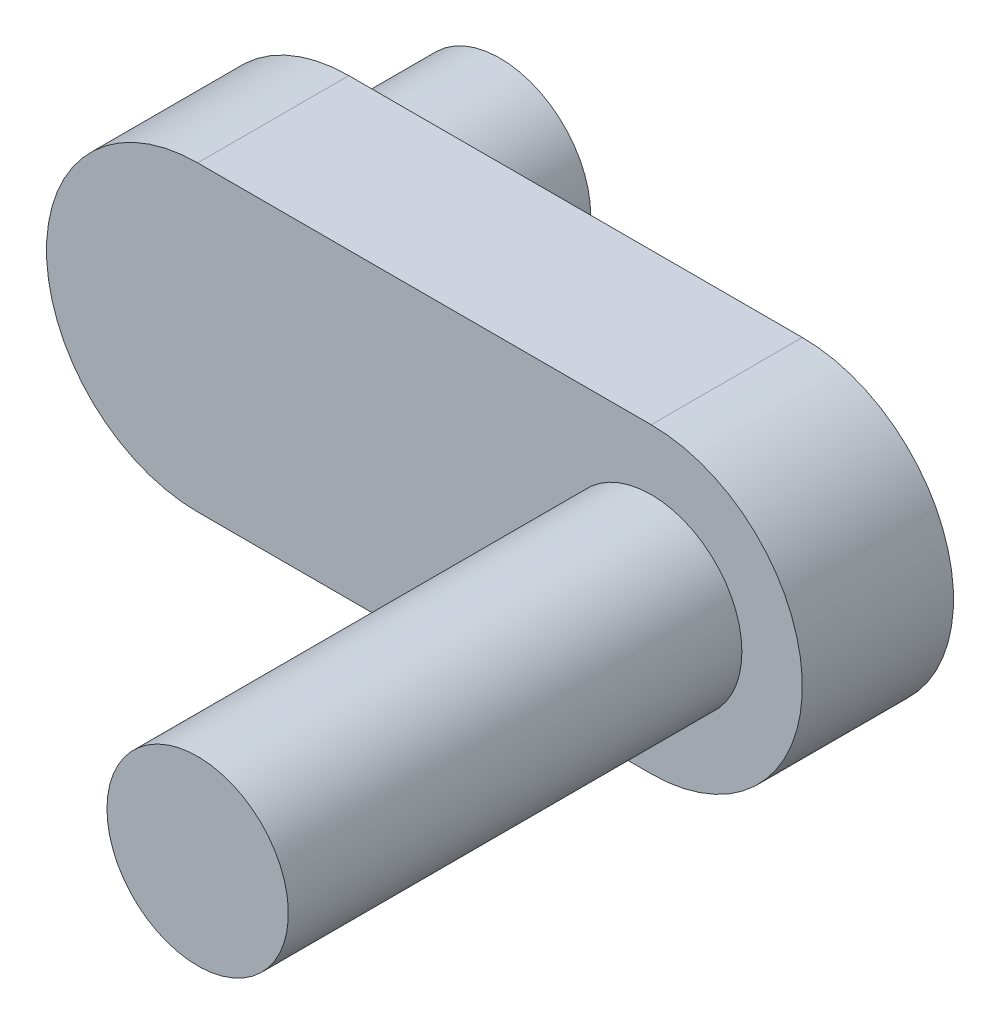
ISO-10303-21;
HEADER;
FILE_DESCRIPTION(('STEP AP214'),'2;1');
FILE_NAME('part.step','',(''),(''),'','','');
FILE_SCHEMA(('AUTOMOTIVE_DESIGN { 1 0 10303 214 1 1 1 1 }'));
ENDSEC;
DATA;
#1=APPLICATION_CONTEXT('core data for automotive mechanical design processes');
#2=APPLICATION_PROTOCOL_DEFINITION('international standard','automotive_design',2000,#1);
#3=PRODUCT_CONTEXT('',#1,'mechanical');
#4=PRODUCT('Part','Part','',(#3));
#5=PRODUCT_RELATED_PRODUCT_CATEGORY('part','',(#4));
#6=PRODUCT_DEFINITION_FORMATION('','',#4);
#7=PRODUCT_DEFINITION_CONTEXT('part definition',#1,'design');
#8=PRODUCT_DEFINITION('design','',#6,#7);
#9=PRODUCT_DEFINITION_SHAPE('','',#8);
#10=(LENGTH_UNIT() NAMED_UNIT(*) SI_UNIT(.MILLI.,.METRE.));
#11=(NAMED_UNIT(*) PLANE_ANGLE_UNIT() SI_UNIT($,.RADIAN.));
#12=(NAMED_UNIT(*) SI_UNIT($,.STERADIAN.) SOLID_ANGLE_UNIT());
#13=UNCERTAINTY_MEASURE_WITH_UNIT(LENGTH_MEASURE(1.E-05),#10,'distance_accuracy_value','');
#14=(GEOMETRIC_REPRESENTATION_CONTEXT(3) GLOBAL_UNCERTAINTY_ASSIGNED_CONTEXT((#13)) GLOBAL_UNIT_ASSIGNED_CONTEXT((#10,
#11,#12)) REPRESENTATION_CONTEXT('',''));
#15=CARTESIAN_POINT('',(0.,0.,0.));
#16=DIRECTION('',(0.,0.,1.));
#17=DIRECTION('',(1.,0.,0.));
#18=AXIS2_PLACEMENT_3D('',#15,#16,#17);
#19=CARTESIAN_POINT('',(7.5,0.,5.));
#20=DIRECTION('',(0.,0.,1.));
#21=DIRECTION('',(1.,0.,0.));
#22=AXIS2_PLACEMENT_3D('',#19,#20,#21);
#23=PLANE('',#22);
#24=CARTESIAN_POINT('',(7.5,0.,5.));
#25=DIRECTION('',(0.,0.,1.));
#26=DIRECTION('',(1.,0.,0.));
#27=AXIS2_PLACEMENT_3D('',#24,#25,#26);
#28=CIRCLE('',#27,5.);
#29=CARTESIAN_POINT('',(7.5,-5.,5.));
#30=VERTEX_POINT('',#29);
#31=CARTESIAN_POINT('',(7.5,5.,5.));
#32=VERTEX_POINT('',#31);
#33=EDGE_CURVE('E86',#30,#32,#28,.T.);
#34=ORIENTED_EDGE('',*,*,#33,.T.);
#35=DIRECTION('',(-1.,0.,0.));
#36=VECTOR('',#35,1.);
#37=CARTESIAN_POINT('',(7.5,5.,5.));
#38=LINE('',#37,#36);
#39=CARTESIAN_POINT('',(-7.5,5.,5.));
#40=VERTEX_POINT('',#39);
#41=EDGE_CURVE('E81',#32,#40,#38,.T.);
#42=ORIENTED_EDGE('',*,*,#41,.T.);
#43=CARTESIAN_POINT('',(-7.5,0.,5.));
#44=DIRECTION('',(0.,0.,1.));
#45=DIRECTION('',(1.,0.,0.));
#46=AXIS2_PLACEMENT_3D('',#43,#44,#45);
#47=CIRCLE('',#46,5.);
#48=CARTESIAN_POINT('',(-7.5,-5.,5.));
#49=VERTEX_POINT('',#48);
#50=EDGE_CURVE('E84',#40,#49,#47,.T.);
#51=ORIENTED_EDGE('',*,*,#50,.T.);
#52=DIRECTION('',(1.,0.,0.));
#53=VECTOR('',#52,1.);
#54=CARTESIAN_POINT('',(7.5,-5.,5.));
#55=LINE('',#54,#53);
#56=EDGE_CURVE('E51',#49,#30,#55,.T.);
#57=ORIENTED_EDGE('',*,*,#56,.T.);
#58=EDGE_LOOP('',(#34,#42,#51,#57));
#59=FACE_BOUND('',#58,.T.);
#60=CARTESIAN_POINT('',(7.5,0.,5.));
#61=DIRECTION('',(0.,0.,1.));
#62=DIRECTION('',(1.,0.,0.));
#63=AXIS2_PLACEMENT_3D('',#60,#61,#62);
#64=CIRCLE('',#63,3.);
#65=CARTESIAN_POINT('',(10.5,0.,5.));
#66=VERTEX_POINT('',#65);
#67=EDGE_CURVE('E101',#66,#66,#64,.T.);
#68=ORIENTED_EDGE('',*,*,#67,.F.);
#69=EDGE_LOOP('',(#68));
#70=FACE_BOUND('',#69,.T.);
#71=ADVANCED_FACE('F34',(#59,#70),#23,.T.);
#72=CARTESIAN_POINT('',(7.5,0.,0.));
#73=DIRECTION('',(0.,0.,1.));
#74=DIRECTION('',(1.,0.,0.));
#75=AXIS2_PLACEMENT_3D('',#72,#73,#74);
#76=PLANE('',#75);
#77=CARTESIAN_POINT('',(7.5,0.,0.));
#78=DIRECTION('',(0.,0.,1.));
#79=DIRECTION('',(1.,0.,0.));
#80=AXIS2_PLACEMENT_3D('',#77,#78,#79);
#81=CIRCLE('',#80,5.);
#82=CARTESIAN_POINT('',(7.5,-5.,0.));
#83=VERTEX_POINT('',#82);
#84=CARTESIAN_POINT('',(7.5,5.,0.));
#85=VERTEX_POINT('',#84);
#86=EDGE_CURVE('E98',#83,#85,#81,.T.);
#87=ORIENTED_EDGE('',*,*,#86,.F.);
#88=DIRECTION('',(1.,0.,0.));
#89=VECTOR('',#88,1.);
#90=CARTESIAN_POINT('',(7.5,-5.,0.));
#91=LINE('',#90,#89);
#92=CARTESIAN_POINT('',(-7.5,-5.,0.));
#93=VERTEX_POINT('',#92);
#94=EDGE_CURVE('E74',#93,#83,#91,.T.);
#95=ORIENTED_EDGE('',*,*,#94,.F.);
#96=CARTESIAN_POINT('',(-7.5,0.,0.));
#97=DIRECTION('',(0.,0.,1.));
#98=DIRECTION('',(1.,0.,0.));
#99=AXIS2_PLACEMENT_3D('',#96,#97,#98);
#100=CIRCLE('',#99,5.);
#101=CARTESIAN_POINT('',(-7.5,5.,0.));
#102=VERTEX_POINT('',#101);
#103=EDGE_CURVE('E68',#102,#93,#100,.T.);
#104=ORIENTED_EDGE('',*,*,#103,.F.);
#105=DIRECTION('',(-1.,0.,0.));
#106=VECTOR('',#105,1.);
#107=CARTESIAN_POINT('',(7.5,5.,0.));
#108=LINE('',#107,#106);
#109=EDGE_CURVE('E90',#85,#102,#108,.T.);
#110=ORIENTED_EDGE('',*,*,#109,.F.);
#111=EDGE_LOOP('',(#87,#95,#104,#110));
#112=FACE_BOUND('',#111,.T.);
#113=CARTESIAN_POINT('',(-7.5,0.,0.));
#114=DIRECTION('',(0.,0.,1.));
#115=DIRECTION('',(1.,0.,0.));
#116=AXIS2_PLACEMENT_3D('',#113,#114,#115);
#117=CIRCLE('',#116,3.);
#118=CARTESIAN_POINT('',(-4.5,0.,0.));
#119=VERTEX_POINT('',#118);
#120=EDGE_CURVE('E115',#119,#119,#117,.T.);
#121=ORIENTED_EDGE('',*,*,#120,.T.);
#122=EDGE_LOOP('',(#121));
#123=FACE_BOUND('',#122,.T.);
#124=ADVANCED_FACE('F109',(#112,#123),#76,.F.);
#125=CARTESIAN_POINT('',(7.5,0.,5.));
#126=DIRECTION('',(0.,0.,-1.));
#127=DIRECTION('',(-1.,0.,0.));
#128=AXIS2_PLACEMENT_3D('',#125,#126,#127);
#129=CYLINDRICAL_SURFACE('',#128,5.);
#130=ORIENTED_EDGE('',*,*,#86,.T.);
#131=DIRECTION('',(0.,0.,-1.));
#132=VECTOR('',#131,1.);
#133=CARTESIAN_POINT('',(7.5,5.,5.));
#134=LINE('',#133,#132);
#135=EDGE_CURVE('E11',#32,#85,#134,.T.);
#136=ORIENTED_EDGE('',*,*,#135,.F.);
#137=ORIENTED_EDGE('',*,*,#33,.F.);
#138=DIRECTION('',(0.,0.,-1.));
#139=VECTOR('',#138,1.);
#140=CARTESIAN_POINT('',(7.5,-5.,5.));
#141=LINE('',#140,#139);
#142=EDGE_CURVE('E94',#30,#83,#141,.T.);
#143=ORIENTED_EDGE('',*,*,#142,.T.);
#144=EDGE_LOOP('',(#130,#136,#137,#143));
#145=FACE_BOUND('',#144,.T.);
#146=ADVANCED_FACE('F36',(#145),#129,.T.);
#147=CARTESIAN_POINT('',(7.5,5.,5.));
#148=DIRECTION('',(0.,-1.,0.));
#149=DIRECTION('',(1.,0.,0.));
#150=AXIS2_PLACEMENT_3D('',#147,#148,#149);
#151=PLANE('',#150);
#152=ORIENTED_EDGE('',*,*,#109,.T.);
#153=DIRECTION('',(0.,0.,-1.));
#154=VECTOR('',#153,1.);
#155=CARTESIAN_POINT('',(-7.5,5.,5.));
#156=LINE('',#155,#154);
#157=EDGE_CURVE('E43',#40,#102,#156,.T.);
#158=ORIENTED_EDGE('',*,*,#157,.F.);
#159=ORIENTED_EDGE('',*,*,#41,.F.);
#160=ORIENTED_EDGE('',*,*,#135,.T.);
#161=EDGE_LOOP('',(#152,#158,#159,#160));
#162=FACE_BOUND('',#161,.T.);
#163=ADVANCED_FACE('F89',(#162),#151,.F.);
#164=CARTESIAN_POINT('',(-7.5,0.,5.));
#165=DIRECTION('',(0.,0.,-1.));
#166=DIRECTION('',(-1.,0.,0.));
#167=AXIS2_PLACEMENT_3D('',#164,#165,#166);
#168=CYLINDRICAL_SURFACE('',#167,5.);
#169=ORIENTED_EDGE('',*,*,#103,.T.);
#170=DIRECTION('',(0.,0.,-1.));
#171=VECTOR('',#170,1.);
#172=CARTESIAN_POINT('',(-7.5,-5.,5.));
#173=LINE('',#172,#171);
#174=EDGE_CURVE('E91',#49,#93,#173,.T.);
#175=ORIENTED_EDGE('',*,*,#174,.F.);
#176=ORIENTED_EDGE('',*,*,#50,.F.);
#177=ORIENTED_EDGE('',*,*,#157,.T.);
#178=EDGE_LOOP('',(#169,#175,#176,#177));
#179=FACE_BOUND('',#178,.T.);
#180=ADVANCED_FACE('F92',(#179),#168,.T.);
#181=CARTESIAN_POINT('',(7.5,-5.,5.));
#182=DIRECTION('',(0.,1.,0.));
#183=DIRECTION('',(-1.,0.,0.));
#184=AXIS2_PLACEMENT_3D('',#181,#182,#183);
#185=PLANE('',#184);
#186=ORIENTED_EDGE('',*,*,#94,.T.);
#187=ORIENTED_EDGE('',*,*,#142,.F.);
#188=ORIENTED_EDGE('',*,*,#56,.F.);
#189=ORIENTED_EDGE('',*,*,#174,.T.);
#190=EDGE_LOOP('',(#186,#187,#188,#189));
#191=FACE_BOUND('',#190,.T.);
#192=ADVANCED_FACE('F106',(#191),#185,.F.);
#193=CARTESIAN_POINT('',(-7.5,0.,-5.));
#194=DIRECTION('',(0.,0.,1.));
#195=DIRECTION('',(1.,0.,0.));
#196=AXIS2_PLACEMENT_3D('',#193,#194,#195);
#197=CYLINDRICAL_SURFACE('',#196,3.);
#198=CARTESIAN_POINT('',(-7.5,0.,-5.));
#199=DIRECTION('',(0.,0.,1.));
#200=DIRECTION('',(1.,0.,0.));
#201=AXIS2_PLACEMENT_3D('',#198,#199,#200);
#202=CIRCLE('',#201,3.);
#203=CARTESIAN_POINT('',(-4.5,0.,-5.));
#204=VERTEX_POINT('',#203);
#205=EDGE_CURVE('E118',#204,#204,#202,.T.);
#206=ORIENTED_EDGE('',*,*,#205,.T.);
#207=EDGE_LOOP('',(#206));
#208=FACE_BOUND('',#207,.T.);
#209=ORIENTED_EDGE('',*,*,#120,.F.);
#210=EDGE_LOOP('',(#209));
#211=FACE_BOUND('',#210,.T.);
#212=ADVANCED_FACE('F143',(#208,#211),#197,.T.);
#213=CARTESIAN_POINT('',(-7.5,0.,-5.));
#214=DIRECTION('',(0.,0.,1.));
#215=DIRECTION('',(1.,0.,0.));
#216=AXIS2_PLACEMENT_3D('',#213,#214,#215);
#217=PLANE('',#216);
#218=ORIENTED_EDGE('',*,*,#205,.F.);
#219=EDGE_LOOP('',(#218));
#220=FACE_BOUND('',#219,.T.);
#221=ADVANCED_FACE('F133',(#220),#217,.F.);
#222=CARTESIAN_POINT('',(7.5,0.,20.));
#223=DIRECTION('',(0.,0.,-1.));
#224=DIRECTION('',(-1.,0.,0.));
#225=AXIS2_PLACEMENT_3D('',#222,#223,#224);
#226=CYLINDRICAL_SURFACE('',#225,3.);
#227=ORIENTED_EDGE('',*,*,#67,.T.);
#228=EDGE_LOOP('',(#227));
#229=FACE_BOUND('',#228,.T.);
#230=CARTESIAN_POINT('',(7.5,0.,20.));
#231=DIRECTION('',(0.,0.,-1.));
#232=DIRECTION('',(-1.,0.,0.));
#233=AXIS2_PLACEMENT_3D('',#230,#231,#232);
#234=CIRCLE('',#233,3.);
#235=CARTESIAN_POINT('',(4.5,0.,20.));
#236=VERTEX_POINT('',#235);
#237=EDGE_CURVE('E121',#236,#236,#234,.T.);
#238=ORIENTED_EDGE('',*,*,#237,.T.);
#239=EDGE_LOOP('',(#238));
#240=FACE_BOUND('',#239,.T.);
#241=ADVANCED_FACE('F125',(#229,#240),#226,.T.);
#242=CARTESIAN_POINT('',(7.5,0.,20.));
#243=DIRECTION('',(0.,0.,-1.));
#244=DIRECTION('',(-1.,0.,0.));
#245=AXIS2_PLACEMENT_3D('',#242,#243,#244);
#246=PLANE('',#245);
#247=ORIENTED_EDGE('',*,*,#237,.F.);
#248=EDGE_LOOP('',(#247));
#249=FACE_BOUND('',#248,.T.);
#250=ADVANCED_FACE('F127',(#249),#246,.F.);
#251=CLOSED_SHELL('',(#71,#124,#146,#163,#180,#192,#212,#221,#241,#250));
#252=MANIFOLD_SOLID_BREP('B2',#251);
#253=ADVANCED_BREP_SHAPE_REPRESENTATION('',(#18,#252),#14);
#254=SHAPE_DEFINITION_REPRESENTATION(#9,#253);
ENDSEC;
END-ISO-10303-21;
